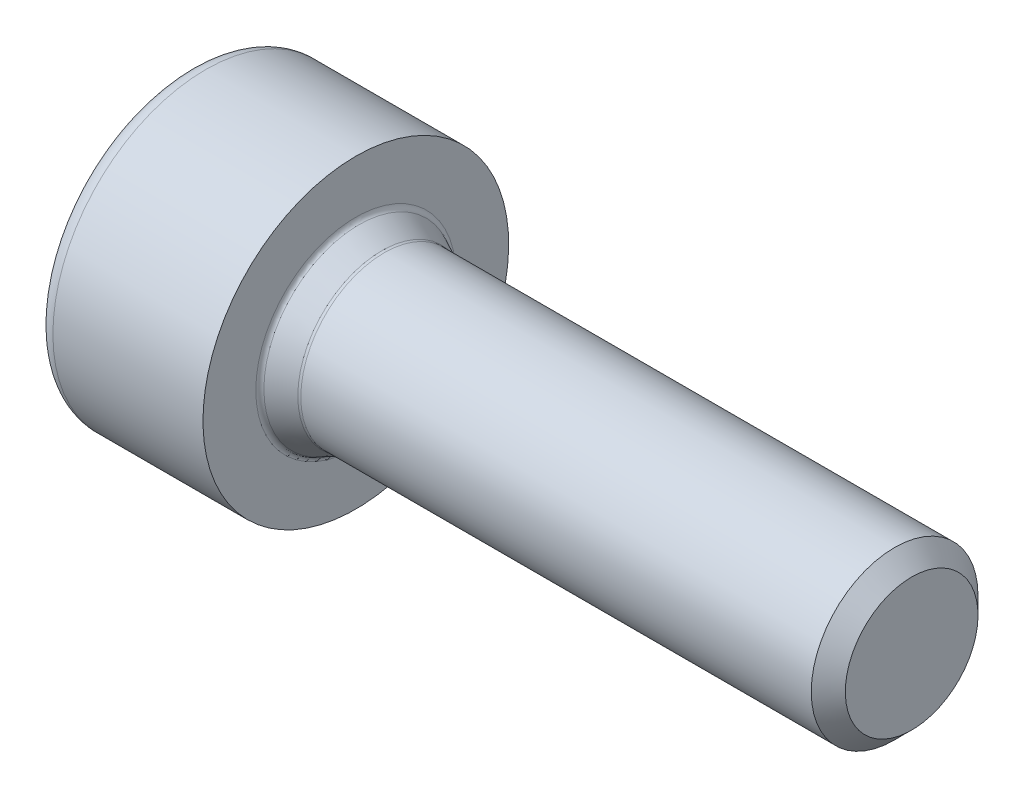
ISO-10303-21;
HEADER;
FILE_DESCRIPTION(('STEP AP214'),'2;1');
FILE_NAME('part.step','',(''),(''),'','','');
FILE_SCHEMA(('AUTOMOTIVE_DESIGN { 1 0 10303 214 1 1 1 1 }'));
ENDSEC;
DATA;
#1=APPLICATION_CONTEXT('core data for automotive mechanical design processes');
#2=APPLICATION_PROTOCOL_DEFINITION('international standard','automotive_design',2000,#1);
#3=PRODUCT_CONTEXT('',#1,'mechanical');
#4=PRODUCT('Part','Part','',(#3));
#5=PRODUCT_RELATED_PRODUCT_CATEGORY('part','',(#4));
#6=PRODUCT_DEFINITION_FORMATION('','',#4);
#7=PRODUCT_DEFINITION_CONTEXT('part definition',#1,'design');
#8=PRODUCT_DEFINITION('design','',#6,#7);
#9=PRODUCT_DEFINITION_SHAPE('','',#8);
#10=(LENGTH_UNIT() NAMED_UNIT(*) SI_UNIT(.MILLI.,.METRE.));
#11=(NAMED_UNIT(*) PLANE_ANGLE_UNIT() SI_UNIT($,.RADIAN.));
#12=(NAMED_UNIT(*) SI_UNIT($,.STERADIAN.) SOLID_ANGLE_UNIT());
#13=UNCERTAINTY_MEASURE_WITH_UNIT(LENGTH_MEASURE(1.E-05),#10,'distance_accuracy_value','');
#14=(GEOMETRIC_REPRESENTATION_CONTEXT(3) GLOBAL_UNCERTAINTY_ASSIGNED_CONTEXT((#13)) GLOBAL_UNIT_ASSIGNED_CONTEXT((#10,
#11,#12)) REPRESENTATION_CONTEXT('',''));
#15=CARTESIAN_POINT('',(0.,0.,0.));
#16=DIRECTION('',(0.,0.,1.));
#17=DIRECTION('',(1.,0.,0.));
#18=AXIS2_PLACEMENT_3D('',#15,#16,#17);
#19=CARTESIAN_POINT('',(-1.35,0.,0.));
#20=DIRECTION('',(1.,0.,0.));
#21=DIRECTION('',(0.,1.,0.));
#22=AXIS2_PLACEMENT_3D('',#19,#20,#21);
#23=CYLINDRICAL_SURFACE('',#22,2.75);
#24=CARTESIAN_POINT('',(0.,0.,0.));
#25=DIRECTION('',(1.,0.,0.));
#26=DIRECTION('',(0.,1.,0.));
#27=AXIS2_PLACEMENT_3D('',#24,#25,#26);
#28=CIRCLE('',#27,2.75);
#29=CARTESIAN_POINT('',(0.,2.75,0.));
#30=VERTEX_POINT('',#29);
#31=EDGE_CURVE('E205',#30,#30,#28,.T.);
#32=ORIENTED_EDGE('',*,*,#31,.F.);
#33=EDGE_LOOP('',(#32));
#34=FACE_BOUND('',#33,.T.);
#35=CARTESIAN_POINT('',(-2.7,0.,0.));
#36=DIRECTION('',(-1.,0.,0.));
#37=DIRECTION('',(0.,0.,1.));
#38=AXIS2_PLACEMENT_3D('',#35,#36,#37);
#39=CIRCLE('',#38,2.75);
#40=CARTESIAN_POINT('',(-2.7,0.,2.75));
#41=VERTEX_POINT('',#40);
#42=EDGE_CURVE('E11',#41,#41,#39,.T.);
#43=ORIENTED_EDGE('',*,*,#42,.F.);
#44=EDGE_LOOP('',(#43));
#45=FACE_BOUND('',#44,.T.);
#46=ADVANCED_FACE('F17',(#34,#45),#23,.T.);
#47=CARTESIAN_POINT('',(-2.7,0.,0.));
#48=DIRECTION('',(-1.,0.,0.));
#49=DIRECTION('',(0.,0.,1.));
#50=AXIS2_PLACEMENT_3D('',#47,#48,#49);
#51=TOROIDAL_SURFACE('',#50,2.45,0.3);
#52=ORIENTED_EDGE('',*,*,#42,.T.);
#53=EDGE_LOOP('',(#52));
#54=FACE_BOUND('',#53,.T.);
#55=CARTESIAN_POINT('',(-3.,0.,0.));
#56=DIRECTION('',(-1.,0.,0.));
#57=DIRECTION('',(0.,1.,0.));
#58=AXIS2_PLACEMENT_3D('',#55,#56,#57);
#59=CIRCLE('',#58,2.45);
#60=CARTESIAN_POINT('',(-3.,2.45,0.));
#61=VERTEX_POINT('',#60);
#62=EDGE_CURVE('E27',#61,#61,#59,.T.);
#63=ORIENTED_EDGE('',*,*,#62,.F.);
#64=EDGE_LOOP('',(#63));
#65=FACE_BOUND('',#64,.T.);
#66=ADVANCED_FACE('F130',(#54,#65),#51,.T.);
#67=CARTESIAN_POINT('',(-3.,1.956642135624,0.));
#68=DIRECTION('',(-1.,0.,0.));
#69=DIRECTION('',(0.,1.,0.));
#70=AXIS2_PLACEMENT_3D('',#67,#68,#69);
#71=PLANE('',#70);
#72=ORIENTED_EDGE('',*,*,#62,.T.);
#73=EDGE_LOOP('',(#72));
#74=FACE_BOUND('',#73,.T.);
#75=CARTESIAN_POINT('',(-3.,0.,0.));
#76=DIRECTION('',(1.,0.,0.));
#77=DIRECTION('',(0.,1.,0.));
#78=AXIS2_PLACEMENT_3D('',#75,#76,#77);
#79=CIRCLE('',#78,1.463284271247);
#80=CARTESIAN_POINT('',(-3.,1.463284271247,0.));
#81=VERTEX_POINT('',#80);
#82=EDGE_CURVE('E400',#81,#81,#79,.T.);
#83=ORIENTED_EDGE('',*,*,#82,.T.);
#84=EDGE_LOOP('',(#83));
#85=FACE_BOUND('',#84,.T.);
#86=ADVANCED_FACE('F136',(#74,#85),#71,.T.);
#87=CARTESIAN_POINT('',(-2.893357864376,0.,0.));
#88=DIRECTION('',(-1.,0.,0.));
#89=DIRECTION('',(0.,1.,0.));
#90=AXIS2_PLACEMENT_3D('',#87,#88,#89);
#91=CONICAL_SURFACE('',#90,1.356642135624,0.7853981633973);
#92=CARTESIAN_POINT('',(-2.786715728753,1.082531754731,-0.625));
#93=CARTESIAN_POINT('',(-2.786715728753,1.096850043605,-0.6001999961917));
#94=CARTESIAN_POINT('',(-2.788688396499,1.125532541932,-0.5505204518016));
#95=CARTESIAN_POINT('',(-2.797550422043,1.16862138683,-0.475888383199));
#96=CARTESIAN_POINT('',(-2.812296923746,1.211993323088,-0.4007659859767));
#97=CARTESIAN_POINT('',(-2.83297622741,1.255885098174,-0.3247432014948));
#98=CARTESIAN_POINT('',(-2.859577507648,1.300406332797,-0.2476301611107));
#99=CARTESIAN_POINT('',(-2.892447493209,1.346136170407,-0.1684237589484));
#100=CARTESIAN_POINT('',(-2.931941269027,1.393441576746,-0.08648839169663));
#101=CARTESIAN_POINT('',(-2.963223842853,1.4265081141,-0.02921546896895));
#102=CARTESIAN_POINT('',(-2.980091401727,1.443375672974,0.));
#103=B_SPLINE_CURVE_WITH_KNOTS('',3,(#92,#93,#94,#95,#96,#97,#98,#99,#100,#101,#102),
.UNSPECIFIED.,.F.,.F.,(4,1,1,1,1,1,1,1,4),(0.,0.125,0.25,0.375,0.5,0.625,0.75,0.875,1.),.UNSPECIFIED.);
#104=CARTESIAN_POINT('',(-2.786715728753,1.082531754731,-0.625));
#105=VERTEX_POINT('',#104);
#106=CARTESIAN_POINT('',(-2.980091401727,1.443375672974,0.));
#107=VERTEX_POINT('',#106);
#108=EDGE_CURVE('E303',#105,#107,#103,.T.);
#109=ORIENTED_EDGE('',*,*,#108,.T.);
#110=CARTESIAN_POINT('',(-2.980091401727,1.443375672974,0.));
#111=CARTESIAN_POINT('',(-2.963222553512,1.42650682476,0.0292177021722));
#112=CARTESIAN_POINT('',(-2.931937797562,1.393437863901,0.08649482253278));
#113=CARTESIAN_POINT('',(-2.892441258227,1.346128311253,0.1684373714021));
#114=CARTESIAN_POINT('',(-2.859571109738,1.300396733317,0.2476467878976));
#115=CARTESIAN_POINT('',(-2.832970747409,1.255874733436,0.3247611537475));
#116=CARTESIAN_POINT('',(-2.81229392661,1.211985830791,0.400778963017));
#117=CARTESIAN_POINT('',(-2.797548323397,1.168613515477,0.4759020167823));
#118=CARTESIAN_POINT('',(-2.788688047017,1.125528518757,0.550527420146));
#119=CARTESIAN_POINT('',(-2.786715728753,1.096848549971,0.6002025832423));
#120=CARTESIAN_POINT('',(-2.786715728753,1.082531754731,0.625));
#121=B_SPLINE_CURVE_WITH_KNOTS('',3,(#110,#111,#112,#113,#114,#115,#116,#117,#118,#119,#120),
.UNSPECIFIED.,.F.,.F.,(4,1,1,1,1,1,1,1,4),(0.,0.125,0.25,0.375,0.5,0.625,0.75,0.875,1.),.UNSPECIFIED.);
#122=CARTESIAN_POINT('',(-2.786715728753,1.082531754731,0.625));
#123=VERTEX_POINT('',#122);
#124=EDGE_CURVE('E300',#107,#123,#121,.T.);
#125=ORIENTED_EDGE('',*,*,#124,.T.);
#126=CARTESIAN_POINT('',(-2.786715728753,1.082531754731,0.625));
#127=CARTESIAN_POINT('',(-2.786715728753,1.068213465856,0.6498000038083));
#128=CARTESIAN_POINT('',(-2.788688396499,1.039530967529,0.6994795481984));
#129=CARTESIAN_POINT('',(-2.797550422043,0.9964421226312,0.774111616801));
#130=CARTESIAN_POINT('',(-2.812296923746,0.9530701863727,0.8492340140233));
#131=CARTESIAN_POINT('',(-2.83297622741,0.9091784112876,0.9252567985052));
#132=CARTESIAN_POINT('',(-2.859577507648,0.8646571766638,1.002369838889));
#133=CARTESIAN_POINT('',(-2.892447493209,0.8189273390538,1.081576241052));
#134=CARTESIAN_POINT('',(-2.931941269027,0.7716219327149,1.163511608303));
#135=CARTESIAN_POINT('',(-2.963223842853,0.7385553953608,1.220784531031));
#136=CARTESIAN_POINT('',(-2.980091401727,0.721687836487,1.25));
#137=B_SPLINE_CURVE_WITH_KNOTS('',3,(#126,#127,#128,#129,#130,#131,#132,#133,#134,#135,#136),
.UNSPECIFIED.,.F.,.F.,(4,1,1,1,1,1,1,1,4),(0.,0.125,0.25,0.375,0.5,0.625,0.75,0.875,1.),.UNSPECIFIED.);
#138=CARTESIAN_POINT('',(-2.980091401727,0.721687836487,1.25));
#139=VERTEX_POINT('',#138);
#140=EDGE_CURVE('E331',#123,#139,#137,.T.);
#141=ORIENTED_EDGE('',*,*,#140,.T.);
#142=CARTESIAN_POINT('',(-2.980091401727,0.721687836487,1.25));
#143=CARTESIAN_POINT('',(-2.963222553512,0.6879501400586,1.25));
#144=CARTESIAN_POINT('',(-2.931937797562,0.6218122183414,1.25));
#145=CARTESIAN_POINT('',(-2.892441258227,0.5271931130458,1.25));
#146=CARTESIAN_POINT('',(-2.859571109738,0.4357299571738,1.25));
#147=CARTESIAN_POINT('',(-2.832970747409,0.3466859574101,1.25));
#148=CARTESIAN_POINT('',(-2.81229392661,0.2589081521202,1.25));
#149=CARTESIAN_POINT('',(-2.797548323397,0.1721635214927,1.25));
#150=CARTESIAN_POINT('',(-2.788688047017,0.08599352805193,1.25));
#151=CARTESIAN_POINT('',(-2.786715728753,0.02863359048053,1.25));
#152=CARTESIAN_POINT('',(-2.786715728753,0.,1.25));
#153=B_SPLINE_CURVE_WITH_KNOTS('',3,(#142,#143,#144,#145,#146,#147,#148,#149,#150,#151,#152),
.UNSPECIFIED.,.F.,.F.,(4,1,1,1,1,1,1,1,4),(0.,0.125,0.25,0.375,0.5,0.625,0.75,0.875,1.),.UNSPECIFIED.);
#154=CARTESIAN_POINT('',(-2.786715728753,0.,1.25));
#155=VERTEX_POINT('',#154);
#156=EDGE_CURVE('E174',#139,#155,#153,.T.);
#157=ORIENTED_EDGE('',*,*,#156,.T.);
#158=CARTESIAN_POINT('',(-2.786715728753,0.,1.25));
#159=CARTESIAN_POINT('',(-2.786715728753,-0.02863657774925,1.25));
#160=CARTESIAN_POINT('',(-2.788688396499,-0.08600157440296,1.25));
#161=CARTESIAN_POINT('',(-2.797550422043,-0.1721792641987,1.25));
#162=CARTESIAN_POINT('',(-2.812296923746,-0.2589231367157,1.25));
#163=CARTESIAN_POINT('',(-2.83297622741,-0.3467066868859,1.25));
#164=CARTESIAN_POINT('',(-2.859577507648,-0.4357491561335,1.25));
#165=CARTESIAN_POINT('',(-2.892447493209,-0.5272088313535,1.25));
#166=CARTESIAN_POINT('',(-2.931941269027,-0.6218196440314,1.25));
#167=CARTESIAN_POINT('',(-2.963223842853,-0.6879527187396,1.25));
#168=CARTESIAN_POINT('',(-2.980091401727,-0.721687836487,1.25));
#169=B_SPLINE_CURVE_WITH_KNOTS('',3,(#158,#159,#160,#161,#162,#163,#164,#165,#166,#167,#168),
.UNSPECIFIED.,.F.,.F.,(4,1,1,1,1,1,1,1,4),(0.,0.125,0.25,0.375,0.5,0.625,0.75,0.875,1.),.UNSPECIFIED.);
#170=CARTESIAN_POINT('',(-2.980091401727,-0.721687836487,1.25));
#171=VERTEX_POINT('',#170);
#172=EDGE_CURVE('E311',#155,#171,#169,.T.);
#173=ORIENTED_EDGE('',*,*,#172,.T.);
#174=CARTESIAN_POINT('',(-2.980091401727,-0.721687836487,1.25));
#175=CARTESIAN_POINT('',(-2.963222553512,-0.7385566847013,1.220782297828));
#176=CARTESIAN_POINT('',(-2.931937797562,-0.7716256455598,1.163505177467));
#177=CARTESIAN_POINT('',(-2.892441258227,-0.8189351982076,1.081562628598));
#178=CARTESIAN_POINT('',(-2.859571109738,-0.8646667761437,1.002353212102));
#179=CARTESIAN_POINT('',(-2.832970747409,-0.9091887760255,0.9252388462525));
#180=CARTESIAN_POINT('',(-2.81229392661,-0.9530776786705,0.849221036983));
#181=CARTESIAN_POINT('',(-2.797548323397,-0.9964499939842,0.7740979832177));
#182=CARTESIAN_POINT('',(-2.788688047017,-1.039534990705,0.699472579854));
#183=CARTESIAN_POINT('',(-2.786715728753,-1.06821495949,0.6497974167577));
#184=CARTESIAN_POINT('',(-2.786715728753,-1.082531754731,0.625));
#185=B_SPLINE_CURVE_WITH_KNOTS('',3,(#174,#175,#176,#177,#178,#179,#180,#181,#182,#183,#184),
.UNSPECIFIED.,.F.,.F.,(4,1,1,1,1,1,1,1,4),(0.,0.125,0.25,0.375,0.5,0.625,0.75,0.875,1.),.UNSPECIFIED.);
#186=CARTESIAN_POINT('',(-2.786715728753,-1.082531754731,0.625));
#187=VERTEX_POINT('',#186);
#188=EDGE_CURVE('E314',#171,#187,#185,.T.);
#189=ORIENTED_EDGE('',*,*,#188,.T.);
#190=CARTESIAN_POINT('',(-2.786715728753,-1.082531754731,0.625));
#191=CARTESIAN_POINT('',(-2.786715728753,-1.096850043605,0.6001999961917));
#192=CARTESIAN_POINT('',(-2.788688396499,-1.125532541932,0.5505204518016));
#193=CARTESIAN_POINT('',(-2.797550422043,-1.16862138683,0.475888383199));
#194=CARTESIAN_POINT('',(-2.812296923746,-1.211993323088,0.4007659859767));
#195=CARTESIAN_POINT('',(-2.83297622741,-1.255885098174,0.3247432014948));
#196=CARTESIAN_POINT('',(-2.859577507648,-1.300406332797,0.2476301611107));
#197=CARTESIAN_POINT('',(-2.892447493209,-1.346136170407,0.1684237589484));
#198=CARTESIAN_POINT('',(-2.931941269027,-1.393441576746,0.08648839169663));
#199=CARTESIAN_POINT('',(-2.963223842853,-1.4265081141,0.02921546896895));
#200=CARTESIAN_POINT('',(-2.980091401727,-1.443375672974,0.));
#201=B_SPLINE_CURVE_WITH_KNOTS('',3,(#190,#191,#192,#193,#194,#195,#196,#197,#198,#199,#200),
.UNSPECIFIED.,.F.,.F.,(4,1,1,1,1,1,1,1,4),(0.,0.125,0.25,0.375,0.5,0.625,0.75,0.875,1.),.UNSPECIFIED.);
#202=CARTESIAN_POINT('',(-2.980091401727,-1.443375672974,0.));
#203=VERTEX_POINT('',#202);
#204=EDGE_CURVE('E36',#187,#203,#201,.T.);
#205=ORIENTED_EDGE('',*,*,#204,.T.);
#206=CARTESIAN_POINT('',(-2.980091401727,-1.443375672974,0.));
#207=CARTESIAN_POINT('',(-2.963222553512,-1.42650682476,-0.0292177021722));
#208=CARTESIAN_POINT('',(-2.931937797562,-1.393437863901,-0.08649482253278));
#209=CARTESIAN_POINT('',(-2.892441258227,-1.346128311253,-0.1684373714021));
#210=CARTESIAN_POINT('',(-2.859571109738,-1.300396733317,-0.2476467878976));
#211=CARTESIAN_POINT('',(-2.832970747409,-1.255874733436,-0.3247611537475));
#212=CARTESIAN_POINT('',(-2.81229392661,-1.211985830791,-0.400778963017));
#213=CARTESIAN_POINT('',(-2.797548323397,-1.168613515477,-0.4759020167823));
#214=CARTESIAN_POINT('',(-2.788688047017,-1.125528518757,-0.550527420146));
#215=CARTESIAN_POINT('',(-2.786715728753,-1.096848549971,-0.6002025832423));
#216=CARTESIAN_POINT('',(-2.786715728753,-1.082531754731,-0.625));
#217=B_SPLINE_CURVE_WITH_KNOTS('',3,(#206,#207,#208,#209,#210,#211,#212,#213,#214,#215,#216),
.UNSPECIFIED.,.F.,.F.,(4,1,1,1,1,1,1,1,4),(0.,0.125,0.25,0.375,0.5,0.625,0.75,0.875,1.),.UNSPECIFIED.);
#218=CARTESIAN_POINT('',(-2.786715728753,-1.082531754731,-0.625));
#219=VERTEX_POINT('',#218);
#220=EDGE_CURVE('E328',#203,#219,#217,.T.);
#221=ORIENTED_EDGE('',*,*,#220,.T.);
#222=CARTESIAN_POINT('',(-2.786715728753,-1.082531754731,-0.625));
#223=CARTESIAN_POINT('',(-2.786715728753,-1.068213465856,-0.6498000038083));
#224=CARTESIAN_POINT('',(-2.788688396499,-1.039530967529,-0.6994795481984));
#225=CARTESIAN_POINT('',(-2.797550422043,-0.9964421226312,-0.774111616801));
#226=CARTESIAN_POINT('',(-2.812296923746,-0.9530701863727,-0.8492340140233));
#227=CARTESIAN_POINT('',(-2.83297622741,-0.9091784112876,-0.9252567985052));
#228=CARTESIAN_POINT('',(-2.859577507648,-0.8646571766638,-1.002369838889));
#229=CARTESIAN_POINT('',(-2.892447493209,-0.8189273390538,-1.081576241052));
#230=CARTESIAN_POINT('',(-2.931941269027,-0.7716219327149,-1.163511608303));
#231=CARTESIAN_POINT('',(-2.963223842853,-0.7385553953608,-1.220784531031));
#232=CARTESIAN_POINT('',(-2.980091401727,-0.721687836487,-1.25));
#233=B_SPLINE_CURVE_WITH_KNOTS('',3,(#222,#223,#224,#225,#226,#227,#228,#229,#230,#231,#232),
.UNSPECIFIED.,.F.,.F.,(4,1,1,1,1,1,1,1,4),(0.,0.125,0.25,0.375,0.5,0.625,0.75,0.875,1.),.UNSPECIFIED.);
#234=CARTESIAN_POINT('',(-2.980091401727,-0.721687836487,-1.25));
#235=VERTEX_POINT('',#234);
#236=EDGE_CURVE('E386',#219,#235,#233,.T.);
#237=ORIENTED_EDGE('',*,*,#236,.T.);
#238=CARTESIAN_POINT('',(-2.980091401727,-0.721687836487,-1.25));
#239=CARTESIAN_POINT('',(-2.963222553512,-0.6879501400586,-1.25));
#240=CARTESIAN_POINT('',(-2.931937797562,-0.6218122183414,-1.25));
#241=CARTESIAN_POINT('',(-2.892441258227,-0.5271931130458,-1.25));
#242=CARTESIAN_POINT('',(-2.859571109738,-0.4357299571738,-1.25));
#243=CARTESIAN_POINT('',(-2.832970747409,-0.3466859574101,-1.25));
#244=CARTESIAN_POINT('',(-2.81229392661,-0.2589081521202,-1.25));
#245=CARTESIAN_POINT('',(-2.797548323397,-0.1721635214927,-1.25));
#246=CARTESIAN_POINT('',(-2.788688047017,-0.08599352805193,-1.25));
#247=CARTESIAN_POINT('',(-2.786715728753,-0.02863359048053,-1.25));
#248=CARTESIAN_POINT('',(-2.786715728753,0.,-1.25));
#249=B_SPLINE_CURVE_WITH_KNOTS('',3,(#238,#239,#240,#241,#242,#243,#244,#245,#246,#247,#248),
.UNSPECIFIED.,.F.,.F.,(4,1,1,1,1,1,1,1,4),(0.,0.125,0.25,0.375,0.5,0.625,0.75,0.875,1.),.UNSPECIFIED.);
#250=CARTESIAN_POINT('',(-2.786715728753,0.,-1.25));
#251=VERTEX_POINT('',#250);
#252=EDGE_CURVE('E379',#235,#251,#249,.T.);
#253=ORIENTED_EDGE('',*,*,#252,.T.);
#254=CARTESIAN_POINT('',(-2.786715728753,0.,-1.25));
#255=CARTESIAN_POINT('',(-2.786715728753,0.02863657774925,-1.25));
#256=CARTESIAN_POINT('',(-2.788688396499,0.08600157440296,-1.25));
#257=CARTESIAN_POINT('',(-2.797550422043,0.1721792641987,-1.25));
#258=CARTESIAN_POINT('',(-2.812296923746,0.2589231367157,-1.25));
#259=CARTESIAN_POINT('',(-2.83297622741,0.3467066868859,-1.25));
#260=CARTESIAN_POINT('',(-2.859577507648,0.4357491561335,-1.25));
#261=CARTESIAN_POINT('',(-2.892447493209,0.5272088313535,-1.25));
#262=CARTESIAN_POINT('',(-2.931941269027,0.6218196440314,-1.25));
#263=CARTESIAN_POINT('',(-2.963223842853,0.6879527187396,-1.25));
#264=CARTESIAN_POINT('',(-2.980091401727,0.721687836487,-1.25));
#265=B_SPLINE_CURVE_WITH_KNOTS('',3,(#254,#255,#256,#257,#258,#259,#260,#261,#262,#263,#264),
.UNSPECIFIED.,.F.,.F.,(4,1,1,1,1,1,1,1,4),(0.,0.125,0.25,0.375,0.5,0.625,0.75,0.875,1.),.UNSPECIFIED.);
#266=CARTESIAN_POINT('',(-2.980091401727,0.721687836487,-1.25));
#267=VERTEX_POINT('',#266);
#268=EDGE_CURVE('E371',#251,#267,#265,.T.);
#269=ORIENTED_EDGE('',*,*,#268,.T.);
#270=CARTESIAN_POINT('',(-2.980091401727,0.721687836487,-1.25));
#271=CARTESIAN_POINT('',(-2.963222553512,0.7385566847013,-1.220782297828));
#272=CARTESIAN_POINT('',(-2.931937797562,0.7716256455598,-1.163505177467));
#273=CARTESIAN_POINT('',(-2.892441258227,0.8189351982076,-1.081562628598));
#274=CARTESIAN_POINT('',(-2.859571109738,0.8646667761437,-1.002353212102));
#275=CARTESIAN_POINT('',(-2.832970747409,0.9091887760255,-0.9252388462525));
#276=CARTESIAN_POINT('',(-2.81229392661,0.9530776786705,-0.849221036983));
#277=CARTESIAN_POINT('',(-2.797548323397,0.9964499939842,-0.7740979832177));
#278=CARTESIAN_POINT('',(-2.788688047017,1.039534990705,-0.699472579854));
#279=CARTESIAN_POINT('',(-2.786715728753,1.06821495949,-0.6497974167577));
#280=CARTESIAN_POINT('',(-2.786715728753,1.082531754731,-0.625));
#281=B_SPLINE_CURVE_WITH_KNOTS('',3,(#270,#271,#272,#273,#274,#275,#276,#277,#278,#279,#280),
.UNSPECIFIED.,.F.,.F.,(4,1,1,1,1,1,1,1,4),(0.,0.125,0.25,0.375,0.5,0.625,0.75,0.875,1.),.UNSPECIFIED.);
#282=EDGE_CURVE('E364',#267,#105,#281,.T.);
#283=ORIENTED_EDGE('',*,*,#282,.T.);
#284=EDGE_LOOP('',(#109,#125,#141,#157,#173,#189,#205,#221,#237,#253,#269,#283));
#285=FACE_BOUND('',#284,.T.);
#286=ORIENTED_EDGE('',*,*,#82,.F.);
#287=EDGE_LOOP('',(#286));
#288=FACE_BOUND('',#287,.T.);
#289=ADVANCED_FACE('F144',(#285,#288),#91,.F.);
#290=CARTESIAN_POINT('',(-1.15,-0.721687836487,1.25));
#291=DIRECTION('',(0.,-0.866025403784429,0.500000000000017));
#292=DIRECTION('',(0.,0.500000000000017,0.866025403784429));
#293=AXIS2_PLACEMENT_3D('',#290,#291,#292);
#294=PLANE('',#293);
#295=DIRECTION('',(1.,0.,0.));
#296=VECTOR('',#295,1.);
#297=CARTESIAN_POINT('',(-2.980091401727,-0.721687836487,1.25));
#298=LINE('',#297,#296);
#299=CARTESIAN_POINT('',(-1.15,-0.721687836487,1.25));
#300=VERTEX_POINT('',#299);
#301=EDGE_CURVE('E309',#171,#300,#298,.T.);
#302=ORIENTED_EDGE('',*,*,#301,.T.);
#303=DIRECTION('',(0.,0.500000000000017,0.866025403784429));
#304=VECTOR('',#303,1.);
#305=CARTESIAN_POINT('',(-1.15,-1.082531754731,0.625));
#306=LINE('',#305,#304);
#307=CARTESIAN_POINT('',(-1.15,-1.082531754731,0.625));
#308=VERTEX_POINT('',#307);
#309=EDGE_CURVE('E178',#308,#300,#306,.T.);
#310=ORIENTED_EDGE('',*,*,#309,.F.);
#311=DIRECTION('',(0.,0.500000000000017,0.866025403784429));
#312=VECTOR('',#311,1.);
#313=CARTESIAN_POINT('',(-1.15,-1.443375672974,0.));
#314=LINE('',#313,#312);
#315=CARTESIAN_POINT('',(-1.15,-1.443375672974,0.));
#316=VERTEX_POINT('',#315);
#317=EDGE_CURVE('E203',#316,#308,#314,.T.);
#318=ORIENTED_EDGE('',*,*,#317,.F.);
#319=DIRECTION('',(1.,0.,0.));
#320=VECTOR('',#319,1.);
#321=CARTESIAN_POINT('',(-2.980091401727,-1.443375672974,0.));
#322=LINE('',#321,#320);
#323=EDGE_CURVE('E312',#203,#316,#322,.T.);
#324=ORIENTED_EDGE('',*,*,#323,.F.);
#325=ORIENTED_EDGE('',*,*,#204,.F.);
#326=ORIENTED_EDGE('',*,*,#188,.F.);
#327=EDGE_LOOP('',(#302,#310,#318,#324,#325,#326));
#328=FACE_BOUND('',#327,.T.);
#329=ADVANCED_FACE('F148',(#328),#294,.F.);
#330=CARTESIAN_POINT('',(-1.15,-1.443375672974,0.));
#331=DIRECTION('',(0.,-0.866025403784429,-0.500000000000017));
#332=DIRECTION('',(0.,-0.500000000000017,0.866025403784429));
#333=AXIS2_PLACEMENT_3D('',#330,#331,#332);
#334=PLANE('',#333);
#335=ORIENTED_EDGE('',*,*,#323,.T.);
#336=DIRECTION('',(0.,-0.500000000000017,0.866025403784429));
#337=VECTOR('',#336,1.);
#338=CARTESIAN_POINT('',(-1.15,-1.082531754731,-0.625));
#339=LINE('',#338,#337);
#340=CARTESIAN_POINT('',(-1.15,-1.082531754731,-0.625));
#341=VERTEX_POINT('',#340);
#342=EDGE_CURVE('E200',#341,#316,#339,.T.);
#343=ORIENTED_EDGE('',*,*,#342,.F.);
#344=DIRECTION('',(0.,-0.500000000000017,0.866025403784429));
#345=VECTOR('',#344,1.);
#346=CARTESIAN_POINT('',(-1.15,-0.721687836487,-1.25));
#347=LINE('',#346,#345);
#348=CARTESIAN_POINT('',(-1.15,-0.721687836487,-1.25));
#349=VERTEX_POINT('',#348);
#350=EDGE_CURVE('E215',#349,#341,#347,.T.);
#351=ORIENTED_EDGE('',*,*,#350,.F.);
#352=DIRECTION('',(1.,0.,0.));
#353=VECTOR('',#352,1.);
#354=CARTESIAN_POINT('',(-2.980091401727,-0.721687836487,-1.25));
#355=LINE('',#354,#353);
#356=EDGE_CURVE('E285',#235,#349,#355,.T.);
#357=ORIENTED_EDGE('',*,*,#356,.F.);
#358=ORIENTED_EDGE('',*,*,#236,.F.);
#359=ORIENTED_EDGE('',*,*,#220,.F.);
#360=EDGE_LOOP('',(#335,#343,#351,#357,#358,#359));
#361=FACE_BOUND('',#360,.T.);
#362=ADVANCED_FACE('F151',(#361),#334,.F.);
#363=CARTESIAN_POINT('',(-1.15,-0.721687836487,-1.25));
#364=DIRECTION('',(0.,0.,-1.));
#365=DIRECTION('',(0.,-1.,0.));
#366=AXIS2_PLACEMENT_3D('',#363,#364,#365);
#367=PLANE('',#366);
#368=ORIENTED_EDGE('',*,*,#356,.T.);
#369=DIRECTION('',(0.,-1.,0.));
#370=VECTOR('',#369,1.);
#371=CARTESIAN_POINT('',(-1.15,0.,-1.25));
#372=LINE('',#371,#370);
#373=CARTESIAN_POINT('',(-1.15,0.,-1.25));
#374=VERTEX_POINT('',#373);
#375=EDGE_CURVE('E204',#374,#349,#372,.T.);
#376=ORIENTED_EDGE('',*,*,#375,.F.);
#377=DIRECTION('',(0.,-1.,0.));
#378=VECTOR('',#377,1.);
#379=CARTESIAN_POINT('',(-1.15,0.721687836487,-1.25));
#380=LINE('',#379,#378);
#381=CARTESIAN_POINT('',(-1.15,0.721687836487,-1.25));
#382=VERTEX_POINT('',#381);
#383=EDGE_CURVE('E210',#382,#374,#380,.T.);
#384=ORIENTED_EDGE('',*,*,#383,.F.);
#385=DIRECTION('',(1.,0.,0.));
#386=VECTOR('',#385,1.);
#387=CARTESIAN_POINT('',(-2.980091401727,0.721687836487,-1.25));
#388=LINE('',#387,#386);
#389=EDGE_CURVE('E288',#267,#382,#388,.T.);
#390=ORIENTED_EDGE('',*,*,#389,.F.);
#391=ORIENTED_EDGE('',*,*,#268,.F.);
#392=ORIENTED_EDGE('',*,*,#252,.F.);
#393=EDGE_LOOP('',(#368,#376,#384,#390,#391,#392));
#394=FACE_BOUND('',#393,.T.);
#395=ADVANCED_FACE('F155',(#394),#367,.F.);
#396=CARTESIAN_POINT('',(-1.15,0.721687836487,-1.25));
#397=DIRECTION('',(0.,0.866025403784429,-0.500000000000017));
#398=DIRECTION('',(0.,-0.500000000000017,-0.866025403784429));
#399=AXIS2_PLACEMENT_3D('',#396,#397,#398);
#400=PLANE('',#399);
#401=ORIENTED_EDGE('',*,*,#389,.T.);
#402=DIRECTION('',(0.,-0.500000000000017,-0.866025403784429));
#403=VECTOR('',#402,1.);
#404=CARTESIAN_POINT('',(-1.15,1.082531754731,-0.625));
#405=LINE('',#404,#403);
#406=CARTESIAN_POINT('',(-1.15,1.082531754731,-0.625));
#407=VERTEX_POINT('',#406);
#408=EDGE_CURVE('E216',#407,#382,#405,.T.);
#409=ORIENTED_EDGE('',*,*,#408,.F.);
#410=DIRECTION('',(0.,-0.500000000000017,-0.866025403784429));
#411=VECTOR('',#410,1.);
#412=CARTESIAN_POINT('',(-1.15,1.443375672974,0.));
#413=LINE('',#412,#411);
#414=CARTESIAN_POINT('',(-1.15,1.443375672974,0.));
#415=VERTEX_POINT('',#414);
#416=EDGE_CURVE('E190',#415,#407,#413,.T.);
#417=ORIENTED_EDGE('',*,*,#416,.F.);
#418=DIRECTION('',(1.,0.,0.));
#419=VECTOR('',#418,1.);
#420=CARTESIAN_POINT('',(-2.980091401727,1.443375672974,0.));
#421=LINE('',#420,#419);
#422=EDGE_CURVE('E177',#107,#415,#421,.T.);
#423=ORIENTED_EDGE('',*,*,#422,.F.);
#424=ORIENTED_EDGE('',*,*,#108,.F.);
#425=ORIENTED_EDGE('',*,*,#282,.F.);
#426=EDGE_LOOP('',(#401,#409,#417,#423,#424,#425));
#427=FACE_BOUND('',#426,.T.);
#428=ADVANCED_FACE('F159',(#427),#400,.F.);
#429=CARTESIAN_POINT('',(-1.15,1.443375672974,0.));
#430=DIRECTION('',(0.,0.866025403784429,0.500000000000017));
#431=DIRECTION('',(0.,0.500000000000017,-0.866025403784429));
#432=AXIS2_PLACEMENT_3D('',#429,#430,#431);
#433=PLANE('',#432);
#434=ORIENTED_EDGE('',*,*,#422,.T.);
#435=DIRECTION('',(0.,0.500000000000017,-0.866025403784429));
#436=VECTOR('',#435,1.);
#437=CARTESIAN_POINT('',(-1.15,1.082531754731,0.625));
#438=LINE('',#437,#436);
#439=CARTESIAN_POINT('',(-1.15,1.082531754731,0.625));
#440=VERTEX_POINT('',#439);
#441=EDGE_CURVE('E211',#440,#415,#438,.T.);
#442=ORIENTED_EDGE('',*,*,#441,.F.);
#443=DIRECTION('',(0.,0.500000000000017,-0.866025403784429));
#444=VECTOR('',#443,1.);
#445=CARTESIAN_POINT('',(-1.15,0.721687836487,1.25));
#446=LINE('',#445,#444);
#447=CARTESIAN_POINT('',(-1.15,0.721687836487,1.25));
#448=VERTEX_POINT('',#447);
#449=EDGE_CURVE('E184',#448,#440,#446,.T.);
#450=ORIENTED_EDGE('',*,*,#449,.F.);
#451=DIRECTION('',(1.,0.,0.));
#452=VECTOR('',#451,1.);
#453=CARTESIAN_POINT('',(-2.980091401727,0.721687836487,1.25));
#454=LINE('',#453,#452);
#455=EDGE_CURVE('E172',#139,#448,#454,.T.);
#456=ORIENTED_EDGE('',*,*,#455,.F.);
#457=ORIENTED_EDGE('',*,*,#140,.F.);
#458=ORIENTED_EDGE('',*,*,#124,.F.);
#459=EDGE_LOOP('',(#434,#442,#450,#456,#457,#458));
#460=FACE_BOUND('',#459,.T.);
#461=ADVANCED_FACE('F163',(#460),#433,.F.);
#462=CARTESIAN_POINT('',(-1.15,0.721687836487,1.25));
#463=DIRECTION('',(0.,0.,1.));
#464=DIRECTION('',(0.,1.,0.));
#465=AXIS2_PLACEMENT_3D('',#462,#463,#464);
#466=PLANE('',#465);
#467=ORIENTED_EDGE('',*,*,#455,.T.);
#468=DIRECTION('',(0.,1.,0.));
#469=VECTOR('',#468,1.);
#470=CARTESIAN_POINT('',(-1.15,0.,1.25));
#471=LINE('',#470,#469);
#472=CARTESIAN_POINT('',(-1.15,0.,1.25));
#473=VERTEX_POINT('',#472);
#474=EDGE_CURVE('E107',#473,#448,#471,.T.);
#475=ORIENTED_EDGE('',*,*,#474,.F.);
#476=DIRECTION('',(0.,1.,0.));
#477=VECTOR('',#476,1.);
#478=CARTESIAN_POINT('',(-1.15,-0.721687836487,1.25));
#479=LINE('',#478,#477);
#480=EDGE_CURVE('E194',#300,#473,#479,.T.);
#481=ORIENTED_EDGE('',*,*,#480,.F.);
#482=ORIENTED_EDGE('',*,*,#301,.F.);
#483=ORIENTED_EDGE('',*,*,#172,.F.);
#484=ORIENTED_EDGE('',*,*,#156,.F.);
#485=EDGE_LOOP('',(#467,#475,#481,#482,#483,#484));
#486=FACE_BOUND('',#485,.T.);
#487=ADVANCED_FACE('F125',(#486),#466,.F.);
#488=CARTESIAN_POINT('',(-1.15,0.,0.));
#489=DIRECTION('',(1.,0.,0.));
#490=DIRECTION('',(0.,0.,-1.));
#491=AXIS2_PLACEMENT_3D('',#488,#489,#490);
#492=PLANE('',#491);
#493=ORIENTED_EDGE('',*,*,#309,.T.);
#494=ORIENTED_EDGE('',*,*,#480,.T.);
#495=CARTESIAN_POINT('',(-1.15,0.,0.));
#496=DIRECTION('',(1.,0.,0.));
#497=DIRECTION('',(0.,0.,1.));
#498=AXIS2_PLACEMENT_3D('',#495,#496,#497);
#499=CIRCLE('',#498,1.25);
#500=EDGE_CURVE('E197',#473,#308,#499,.T.);
#501=ORIENTED_EDGE('',*,*,#500,.T.);
#502=EDGE_LOOP('',(#493,#494,#501));
#503=FACE_BOUND('',#502,.T.);
#504=ADVANCED_FACE('F114',(#503),#492,.F.);
#505=CARTESIAN_POINT('',(-0.7963729601214,0.,0.));
#506=DIRECTION('',(-1.,0.,0.));
#507=DIRECTION('',(0.,1.,0.));
#508=AXIS2_PLACEMENT_3D('',#505,#506,#507);
#509=CONICAL_SURFACE('',#508,0.6375,1.0471975511964);
#510=CARTESIAN_POINT('',(-1.15,0.,0.));
#511=DIRECTION('',(1.,0.,0.));
#512=DIRECTION('',(0.,-0.866025403784429,-0.500000000000017));
#513=AXIS2_PLACEMENT_3D('',#510,#511,#512);
#514=CIRCLE('',#513,1.25);
#515=EDGE_CURVE('E212',#341,#374,#514,.T.);
#516=ORIENTED_EDGE('',*,*,#515,.F.);
#517=CARTESIAN_POINT('',(-1.15,0.,0.));
#518=DIRECTION('',(1.,0.,0.));
#519=DIRECTION('',(0.,-0.866025403784429,0.500000000000017));
#520=AXIS2_PLACEMENT_3D('',#517,#518,#519);
#521=CIRCLE('',#520,1.25);
#522=EDGE_CURVE('E201',#308,#341,#521,.T.);
#523=ORIENTED_EDGE('',*,*,#522,.F.);
#524=ORIENTED_EDGE('',*,*,#500,.F.);
#525=CARTESIAN_POINT('',(-1.15,0.,0.));
#526=DIRECTION('',(1.,0.,0.));
#527=DIRECTION('',(0.,0.866025403784429,0.500000000000017));
#528=AXIS2_PLACEMENT_3D('',#525,#526,#527);
#529=CIRCLE('',#528,1.25);
#530=EDGE_CURVE('E186',#440,#473,#529,.T.);
#531=ORIENTED_EDGE('',*,*,#530,.F.);
#532=CARTESIAN_POINT('',(-1.15,0.,0.));
#533=DIRECTION('',(1.,0.,0.));
#534=DIRECTION('',(0.,1.,0.));
#535=AXIS2_PLACEMENT_3D('',#532,#533,#534);
#536=CIRCLE('',#535,1.25);
#537=EDGE_CURVE('E187',#407,#440,#536,.T.);
#538=ORIENTED_EDGE('',*,*,#537,.F.);
#539=CARTESIAN_POINT('',(-1.15,0.,0.));
#540=DIRECTION('',(1.,0.,0.));
#541=DIRECTION('',(0.,0.,-1.));
#542=AXIS2_PLACEMENT_3D('',#539,#540,#541);
#543=CIRCLE('',#542,1.25);
#544=EDGE_CURVE('E207',#374,#407,#543,.T.);
#545=ORIENTED_EDGE('',*,*,#544,.F.);
#546=EDGE_LOOP('',(#516,#523,#524,#531,#538,#545));
#547=FACE_BOUND('',#546,.T.);
#548=CARTESIAN_POINT('',(-0.428312163513,0.,0.));
#549=VERTEX_POINT('',#548);
#550=VERTEX_LOOP('',#549);
#551=FACE_BOUND('',#550,.T.);
#552=ADVANCED_FACE('F111',(#547,#551),#509,.F.);
#553=CARTESIAN_POINT('',(-1.15,0.,0.));
#554=DIRECTION('',(1.,0.,0.));
#555=DIRECTION('',(0.,0.,-1.));
#556=AXIS2_PLACEMENT_3D('',#553,#554,#555);
#557=PLANE('',#556);
#558=ORIENTED_EDGE('',*,*,#342,.T.);
#559=ORIENTED_EDGE('',*,*,#317,.T.);
#560=ORIENTED_EDGE('',*,*,#522,.T.);
#561=EDGE_LOOP('',(#558,#559,#560));
#562=FACE_BOUND('',#561,.T.);
#563=ADVANCED_FACE('F113',(#562),#557,.F.);
#564=CARTESIAN_POINT('',(-1.15,0.,0.));
#565=DIRECTION('',(1.,0.,0.));
#566=DIRECTION('',(0.,0.,-1.));
#567=AXIS2_PLACEMENT_3D('',#564,#565,#566);
#568=PLANE('',#567);
#569=ORIENTED_EDGE('',*,*,#375,.T.);
#570=ORIENTED_EDGE('',*,*,#350,.T.);
#571=ORIENTED_EDGE('',*,*,#515,.T.);
#572=EDGE_LOOP('',(#569,#570,#571));
#573=FACE_BOUND('',#572,.T.);
#574=ADVANCED_FACE('F122',(#573),#568,.F.);
#575=CARTESIAN_POINT('',(-1.15,0.,0.));
#576=DIRECTION('',(1.,0.,0.));
#577=DIRECTION('',(0.,0.,-1.));
#578=AXIS2_PLACEMENT_3D('',#575,#576,#577);
#579=PLANE('',#578);
#580=ORIENTED_EDGE('',*,*,#408,.T.);
#581=ORIENTED_EDGE('',*,*,#383,.T.);
#582=ORIENTED_EDGE('',*,*,#544,.T.);
#583=EDGE_LOOP('',(#580,#581,#582));
#584=FACE_BOUND('',#583,.T.);
#585=ADVANCED_FACE('F267',(#584),#579,.F.);
#586=CARTESIAN_POINT('',(-1.15,0.,0.));
#587=DIRECTION('',(1.,0.,0.));
#588=DIRECTION('',(0.,0.,-1.));
#589=AXIS2_PLACEMENT_3D('',#586,#587,#588);
#590=PLANE('',#589);
#591=ORIENTED_EDGE('',*,*,#441,.T.);
#592=ORIENTED_EDGE('',*,*,#416,.T.);
#593=ORIENTED_EDGE('',*,*,#537,.T.);
#594=EDGE_LOOP('',(#591,#592,#593));
#595=FACE_BOUND('',#594,.T.);
#596=ADVANCED_FACE('F264',(#595),#590,.F.);
#597=CARTESIAN_POINT('',(-1.15,0.,0.));
#598=DIRECTION('',(1.,0.,0.));
#599=DIRECTION('',(0.,0.,-1.));
#600=AXIS2_PLACEMENT_3D('',#597,#598,#599);
#601=PLANE('',#600);
#602=ORIENTED_EDGE('',*,*,#474,.T.);
#603=ORIENTED_EDGE('',*,*,#449,.T.);
#604=ORIENTED_EDGE('',*,*,#530,.T.);
#605=EDGE_LOOP('',(#602,#603,#604));
#606=FACE_BOUND('',#605,.T.);
#607=ADVANCED_FACE('F183',(#606),#601,.F.);
#608=CARTESIAN_POINT('',(0.,2.275,0.));
#609=DIRECTION('',(1.,0.,0.));
#610=DIRECTION('',(0.,-1.,0.));
#611=AXIS2_PLACEMENT_3D('',#608,#609,#610);
#612=PLANE('',#611);
#613=ORIENTED_EDGE('',*,*,#31,.T.);
#614=EDGE_LOOP('',(#613));
#615=FACE_BOUND('',#614,.T.);
#616=CARTESIAN_POINT('',(0.,0.,0.));
#617=DIRECTION('',(-1.,0.,0.));
#618=DIRECTION('',(0.,0.,-1.));
#619=AXIS2_PLACEMENT_3D('',#616,#617,#618);
#620=CIRCLE('',#619,1.8);
#621=CARTESIAN_POINT('',(0.,0.,-1.8));
#622=VERTEX_POINT('',#621);
#623=EDGE_CURVE('E217',#622,#622,#620,.T.);
#624=ORIENTED_EDGE('',*,*,#623,.T.);
#625=EDGE_LOOP('',(#624));
#626=FACE_BOUND('',#625,.T.);
#627=ADVANCED_FACE('F257',(#615,#626),#612,.T.);
#628=CARTESIAN_POINT('',(0.1,0.,0.));
#629=DIRECTION('',(-1.,0.,0.));
#630=DIRECTION('',(0.,0.,1.));
#631=AXIS2_PLACEMENT_3D('',#628,#629,#630);
#632=TOROIDAL_SURFACE('',#631,1.8,0.1);
#633=CARTESIAN_POINT('',(0.05615763679786,0.,0.));
#634=DIRECTION('',(-1.,0.,0.));
#635=DIRECTION('',(0.,0.,1.));
#636=AXIS2_PLACEMENT_3D('',#633,#634,#635);
#637=CIRCLE('',#636,1.710123155436);
#638=CARTESIAN_POINT('',(0.05615763679786,0.,1.710123155436));
#639=VERTEX_POINT('',#638);
#640=EDGE_CURVE('E220',#639,#639,#637,.T.);
#641=ORIENTED_EDGE('',*,*,#640,.T.);
#642=EDGE_LOOP('',(#641));
#643=FACE_BOUND('',#642,.T.);
#644=ORIENTED_EDGE('',*,*,#623,.F.);
#645=EDGE_LOOP('',(#644));
#646=FACE_BOUND('',#645,.T.);
#647=ADVANCED_FACE('F253',(#643,#646),#632,.F.);
#648=CARTESIAN_POINT('',(0.2611576367979,0.,0.));
#649=DIRECTION('',(-1.,0.,0.));
#650=DIRECTION('',(0.,1.,0.));
#651=AXIS2_PLACEMENT_3D('',#648,#649,#650);
#652=CONICAL_SURFACE('',#651,1.610123155436,0.453844001521399);
#653=CARTESIAN_POINT('',(0.4661576367979,0.,0.));
#654=DIRECTION('',(1.,0.,0.));
#655=DIRECTION('',(0.,0.,1.));
#656=AXIS2_PLACEMENT_3D('',#653,#654,#655);
#657=CIRCLE('',#656,1.510123155436);
#658=CARTESIAN_POINT('',(0.4661576367979,0.,1.510123155436));
#659=VERTEX_POINT('',#658);
#660=EDGE_CURVE('E224',#659,#659,#657,.T.);
#661=ORIENTED_EDGE('',*,*,#660,.F.);
#662=EDGE_LOOP('',(#661));
#663=FACE_BOUND('',#662,.T.);
#664=ORIENTED_EDGE('',*,*,#640,.F.);
#665=EDGE_LOOP('',(#664));
#666=FACE_BOUND('',#665,.T.);
#667=ADVANCED_FACE('F249',(#663,#666),#652,.T.);
#668=CARTESIAN_POINT('',(0.51,0.,0.));
#669=DIRECTION('',(-1.,0.,0.));
#670=DIRECTION('',(0.,0.,1.));
#671=AXIS2_PLACEMENT_3D('',#668,#669,#670);
#672=TOROIDAL_SURFACE('',#671,1.6,0.1);
#673=CARTESIAN_POINT('',(0.51,0.,0.));
#674=DIRECTION('',(-1.,0.,0.));
#675=DIRECTION('',(0.,0.,-1.));
#676=AXIS2_PLACEMENT_3D('',#673,#674,#675);
#677=CIRCLE('',#676,1.5);
#678=CARTESIAN_POINT('',(0.51,0.,-1.5));
#679=VERTEX_POINT('',#678);
#680=EDGE_CURVE('E223',#679,#679,#677,.T.);
#681=ORIENTED_EDGE('',*,*,#680,.T.);
#682=EDGE_LOOP('',(#681));
#683=FACE_BOUND('',#682,.T.);
#684=ORIENTED_EDGE('',*,*,#660,.T.);
#685=EDGE_LOOP('',(#684));
#686=FACE_BOUND('',#685,.T.);
#687=ADVANCED_FACE('F243',(#683,#686),#672,.F.);
#688=CARTESIAN_POINT('',(5.10175,0.,0.));
#689=DIRECTION('',(1.,0.,0.));
#690=DIRECTION('',(0.,1.,0.));
#691=AXIS2_PLACEMENT_3D('',#688,#689,#690);
#692=CYLINDRICAL_SURFACE('',#691,1.5);
#693=CARTESIAN_POINT('',(9.6935,0.,0.));
#694=DIRECTION('',(1.,0.,0.));
#695=DIRECTION('',(0.,-1.,0.));
#696=AXIS2_PLACEMENT_3D('',#693,#694,#695);
#697=CIRCLE('',#696,1.5);
#698=CARTESIAN_POINT('',(9.6935,-1.5,0.));
#699=VERTEX_POINT('',#698);
#700=EDGE_CURVE('E227',#699,#699,#697,.T.);
#701=ORIENTED_EDGE('',*,*,#700,.F.);
#702=EDGE_LOOP('',(#701));
#703=FACE_BOUND('',#702,.T.);
#704=ORIENTED_EDGE('',*,*,#680,.F.);
#705=EDGE_LOOP('',(#704));
#706=FACE_BOUND('',#705,.T.);
#707=ADVANCED_FACE('F238',(#703,#706),#692,.T.);
#708=CARTESIAN_POINT('',(9.84675,0.,0.));
#709=DIRECTION('',(-1.,0.,0.));
#710=DIRECTION('',(0.,1.,0.));
#711=AXIS2_PLACEMENT_3D('',#708,#709,#710);
#712=CONICAL_SURFACE('',#711,1.34675,0.7853981633973);
#713=CARTESIAN_POINT('',(10.,0.,0.));
#714=DIRECTION('',(1.,0.,0.));
#715=DIRECTION('',(0.,1.,0.));
#716=AXIS2_PLACEMENT_3D('',#713,#714,#715);
#717=CIRCLE('',#716,1.1935);
#718=CARTESIAN_POINT('',(10.,1.1935,0.));
#719=VERTEX_POINT('',#718);
#720=EDGE_CURVE('E21',#719,#719,#717,.T.);
#721=ORIENTED_EDGE('',*,*,#720,.F.);
#722=EDGE_LOOP('',(#721));
#723=FACE_BOUND('',#722,.T.);
#724=ORIENTED_EDGE('',*,*,#700,.T.);
#725=EDGE_LOOP('',(#724));
#726=FACE_BOUND('',#725,.T.);
#727=ADVANCED_FACE('F236',(#723,#726),#712,.T.);
#728=CARTESIAN_POINT('',(10.,0.59675,0.));
#729=DIRECTION('',(1.,0.,0.));
#730=DIRECTION('',(0.,-1.,0.));
#731=AXIS2_PLACEMENT_3D('',#728,#729,#730);
#732=PLANE('',#731);
#733=ORIENTED_EDGE('',*,*,#720,.T.);
#734=EDGE_LOOP('',(#733));
#735=FACE_BOUND('',#734,.T.);
#736=ADVANCED_FACE('F19',(#735),#732,.T.);
#737=CLOSED_SHELL('',(#46,#66,#86,#289,#329,#362,#395,#428,#461,#487,#504,#552,#563,#574,#585,
#596,#607,#627,#647,#667,#687,#707,#727,#736));
#738=MANIFOLD_SOLID_BREP('B1',#737);
#739=ADVANCED_BREP_SHAPE_REPRESENTATION('',(#18,#738),#14);
#740=SHAPE_DEFINITION_REPRESENTATION(#9,#739);
ENDSEC;
END-ISO-10303-21;
